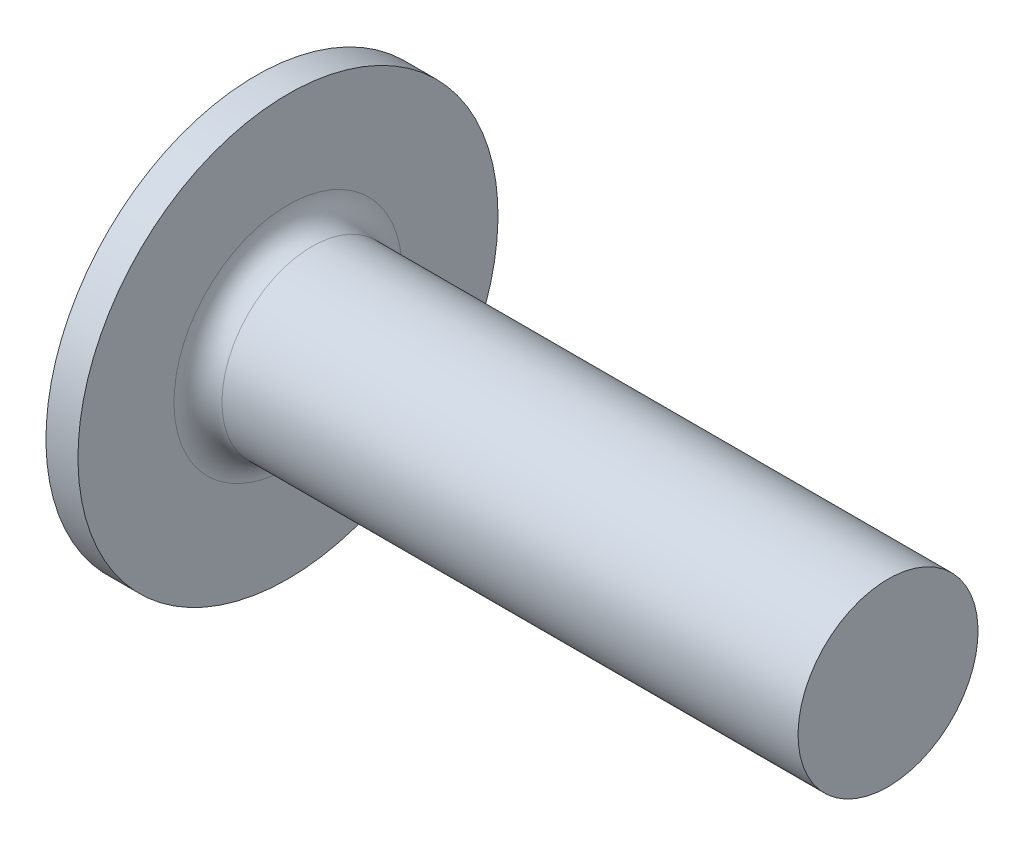
ISO-10303-21;
HEADER;
FILE_DESCRIPTION(('STEP AP214'),'2;1');
FILE_NAME('part.step','',(''),(''),'','','');
FILE_SCHEMA(('AUTOMOTIVE_DESIGN { 1 0 10303 214 1 1 1 1 }'));
ENDSEC;
DATA;
#1=APPLICATION_CONTEXT('core data for automotive mechanical design processes');
#2=APPLICATION_PROTOCOL_DEFINITION('international standard','automotive_design',2000,#1);
#3=PRODUCT_CONTEXT('',#1,'mechanical');
#4=PRODUCT('Part','Part','',(#3));
#5=PRODUCT_RELATED_PRODUCT_CATEGORY('part','',(#4));
#6=PRODUCT_DEFINITION_FORMATION('','',#4);
#7=PRODUCT_DEFINITION_CONTEXT('part definition',#1,'design');
#8=PRODUCT_DEFINITION('design','',#6,#7);
#9=PRODUCT_DEFINITION_SHAPE('','',#8);
#10=(LENGTH_UNIT() NAMED_UNIT(*) SI_UNIT(.MILLI.,.METRE.));
#11=(NAMED_UNIT(*) PLANE_ANGLE_UNIT() SI_UNIT($,.RADIAN.));
#12=(NAMED_UNIT(*) SI_UNIT($,.STERADIAN.) SOLID_ANGLE_UNIT());
#13=UNCERTAINTY_MEASURE_WITH_UNIT(LENGTH_MEASURE(1.E-05),#10,'distance_accuracy_value','');
#14=(GEOMETRIC_REPRESENTATION_CONTEXT(3) GLOBAL_UNCERTAINTY_ASSIGNED_CONTEXT((#13)) GLOBAL_UNIT_ASSIGNED_CONTEXT((#10,
#11,#12)) REPRESENTATION_CONTEXT('',''));
#15=CARTESIAN_POINT('',(0.,0.,0.));
#16=DIRECTION('',(0.,0.,1.));
#17=DIRECTION('',(1.,0.,0.));
#18=AXIS2_PLACEMENT_3D('',#15,#16,#17);
#19=CARTESIAN_POINT('',(-0.8,0.,0.));
#20=DIRECTION('',(1.,0.,0.));
#21=DIRECTION('',(0.,1.,0.));
#22=AXIS2_PLACEMENT_3D('',#19,#20,#21);
#23=PLANE('',#22);
#24=CARTESIAN_POINT('',(-0.8,0.,0.));
#25=DIRECTION('',(-1.,0.,0.));
#26=DIRECTION('',(0.,-1.,0.));
#27=AXIS2_PLACEMENT_3D('',#24,#25,#26);
#28=CIRCLE('',#27,3.0381197846483);
#29=CARTESIAN_POINT('',(-0.799999999999999,-3.0381197846483,0.));
#30=VERTEX_POINT('',#29);
#31=EDGE_CURVE('E214',#30,#30,#28,.T.);
#32=ORIENTED_EDGE('',*,*,#31,.T.);
#33=EDGE_LOOP('',(#32));
#34=FACE_BOUND('',#33,.T.);
#35=CARTESIAN_POINT('',(-0.8,0.82446015814705,0.476002294242327));
#36=DIRECTION('',(-1.,0.,0.));
#37=DIRECTION('',(0.,0.,-1.));
#38=AXIS2_PLACEMENT_3D('',#35,#36,#37);
#39=CIRCLE('',#38,0.317004588484645);
#40=CARTESIAN_POINT('',(-0.8,0.744268952333995,0.169308180130939));
#41=VERTEX_POINT('',#40);
#42=CARTESIAN_POINT('',(-0.8,0.518759661228898,0.559901729903804));
#43=VERTEX_POINT('',#42);
#44=EDGE_CURVE('E53',#41,#43,#39,.T.);
#45=ORIENTED_EDGE('',*,*,#44,.T.);
#46=CARTESIAN_POINT('',(-0.8,0.349999999999996,0.606217782649109));
#47=DIRECTION('',(1.,0.,0.));
#48=DIRECTION('',(0.,0.,-1.));
#49=AXIS2_PLACEMENT_3D('',#46,#47,#48);
#50=CIRCLE('',#49,0.174999999999998);
#51=CARTESIAN_POINT('',(-0.8,0.225509291105093,0.729209910034739));
#52=VERTEX_POINT('',#51);
#53=EDGE_CURVE('E161',#43,#52,#50,.T.);
#54=ORIENTED_EDGE('',*,*,#53,.T.);
#55=CARTESIAN_POINT('',(-0.8,0.,0.952004588484645));
#56=DIRECTION('',(-1.,0.,0.));
#57=DIRECTION('',(0.,0.,-1.));
#58=AXIS2_PLACEMENT_3D('',#55,#56,#57);
#59=CIRCLE('',#58,0.317004588484644);
#60=CARTESIAN_POINT('',(-0.8,-0.225509291105094,0.72920991003474));
#61=VERTEX_POINT('',#60);
#62=EDGE_CURVE('E164',#52,#61,#59,.T.);
#63=ORIENTED_EDGE('',*,*,#62,.T.);
#64=CARTESIAN_POINT('',(-0.8,-0.350000000000001,0.606217782649107));
#65=DIRECTION('',(1.,0.,0.));
#66=DIRECTION('',(0.,0.,-1.));
#67=AXIS2_PLACEMENT_3D('',#64,#65,#66);
#68=CIRCLE('',#67,0.175000000000001);
#69=CARTESIAN_POINT('',(-0.8,-0.518759661228905,0.559901729903797));
#70=VERTEX_POINT('',#69);
#71=EDGE_CURVE('E167',#61,#70,#68,.T.);
#72=ORIENTED_EDGE('',*,*,#71,.T.);
#73=CARTESIAN_POINT('',(-0.8,-0.824460158147046,0.476002294242316));
#74=DIRECTION('',(-1.,0.,0.));
#75=DIRECTION('',(0.,0.,-1.));
#76=AXIS2_PLACEMENT_3D('',#73,#74,#75);
#77=CIRCLE('',#76,0.317004588484636);
#78=CARTESIAN_POINT('',(-0.8,-0.744268952333995,0.16930818013094));
#79=VERTEX_POINT('',#78);
#80=EDGE_CURVE('E170',#70,#79,#77,.T.);
#81=ORIENTED_EDGE('',*,*,#80,.T.);
#82=CARTESIAN_POINT('',(-0.8,-0.7,0.));
#83=DIRECTION('',(1.,0.,0.));
#84=DIRECTION('',(0.,0.,-1.));
#85=AXIS2_PLACEMENT_3D('',#82,#83,#84);
#86=CIRCLE('',#85,0.175000000000001);
#87=CARTESIAN_POINT('',(-0.8,-0.744268952333996,-0.169308180130941));
#88=VERTEX_POINT('',#87);
#89=EDGE_CURVE('E173',#79,#88,#86,.T.);
#90=ORIENTED_EDGE('',*,*,#89,.T.);
#91=CARTESIAN_POINT('',(-0.8,-0.82446015814705,-0.476002294242326));
#92=DIRECTION('',(-1.,0.,0.));
#93=DIRECTION('',(0.,0.,-1.));
#94=AXIS2_PLACEMENT_3D('',#91,#92,#93);
#95=CIRCLE('',#94,0.317004588484645);
#96=CARTESIAN_POINT('',(-0.8,-0.518759661228898,-0.559901729903804));
#97=VERTEX_POINT('',#96);
#98=EDGE_CURVE('E176',#88,#97,#95,.T.);
#99=ORIENTED_EDGE('',*,*,#98,.T.);
#100=CARTESIAN_POINT('',(-0.8,-0.349999999999996,-0.606217782649109));
#101=DIRECTION('',(1.,0.,0.));
#102=DIRECTION('',(0.,0.,-1.));
#103=AXIS2_PLACEMENT_3D('',#100,#101,#102);
#104=CIRCLE('',#103,0.174999999999999);
#105=CARTESIAN_POINT('',(-0.8,-0.225509291105093,-0.729209910034739));
#106=VERTEX_POINT('',#105);
#107=EDGE_CURVE('E179',#97,#106,#104,.T.);
#108=ORIENTED_EDGE('',*,*,#107,.T.);
#109=CARTESIAN_POINT('',(-0.8,0.,-0.952004588484645));
#110=DIRECTION('',(-1.,0.,0.));
#111=DIRECTION('',(0.,0.,-1.));
#112=AXIS2_PLACEMENT_3D('',#109,#110,#111);
#113=CIRCLE('',#112,0.317004588484644);
#114=CARTESIAN_POINT('',(-0.8,0.225509291105094,-0.729209910034739));
#115=VERTEX_POINT('',#114);
#116=EDGE_CURVE('E182',#106,#115,#113,.T.);
#117=ORIENTED_EDGE('',*,*,#116,.T.);
#118=CARTESIAN_POINT('',(-0.8,0.350000000000001,-0.606217782649107));
#119=DIRECTION('',(1.,0.,0.));
#120=DIRECTION('',(0.,0.,-1.));
#121=AXIS2_PLACEMENT_3D('',#118,#119,#120);
#122=CIRCLE('',#121,0.175);
#123=CARTESIAN_POINT('',(-0.8,0.518759661228904,-0.5599017299038));
#124=VERTEX_POINT('',#123);
#125=EDGE_CURVE('E185',#115,#124,#122,.T.);
#126=ORIENTED_EDGE('',*,*,#125,.T.);
#127=CARTESIAN_POINT('',(-0.8,0.824460158147054,-0.47600229424232));
#128=DIRECTION('',(-1.,0.,0.));
#129=DIRECTION('',(0.,0.,-1.));
#130=AXIS2_PLACEMENT_3D('',#127,#128,#129);
#131=CIRCLE('',#130,0.317004588484644);
#132=CARTESIAN_POINT('',(-0.8,0.744268952333997,-0.169308180130939));
#133=VERTEX_POINT('',#132);
#134=EDGE_CURVE('E151',#124,#133,#131,.T.);
#135=ORIENTED_EDGE('',*,*,#134,.T.);
#136=CARTESIAN_POINT('',(-0.8,0.7,0.));
#137=DIRECTION('',(1.,0.,0.));
#138=DIRECTION('',(0.,0.,-1.));
#139=AXIS2_PLACEMENT_3D('',#136,#137,#138);
#140=CIRCLE('',#139,0.175);
#141=EDGE_CURVE('E188',#133,#41,#140,.T.);
#142=ORIENTED_EDGE('',*,*,#141,.T.);
#143=EDGE_LOOP('',(#45,#54,#63,#72,#81,#90,#99,#108,#117,#126,#135,#142));
#144=FACE_BOUND('',#143,.T.);
#145=ADVANCED_FACE('F38',(#34,#144),#23,.F.);
#146=CARTESIAN_POINT('',(0.,3.5,0.));
#147=DIRECTION('',(-1.,0.,0.));
#148=DIRECTION('',(0.,-1.,0.));
#149=AXIS2_PLACEMENT_3D('',#146,#147,#148);
#150=PLANE('',#149);
#151=CARTESIAN_POINT('',(0.,0.,0.));
#152=DIRECTION('',(-1.,0.,0.));
#153=DIRECTION('',(0.,-1.,0.));
#154=AXIS2_PLACEMENT_3D('',#151,#152,#153);
#155=CIRCLE('',#154,1.9);
#156=CARTESIAN_POINT('',(0.,-1.9,0.));
#157=VERTEX_POINT('',#156);
#158=EDGE_CURVE('E46',#157,#157,#155,.T.);
#159=ORIENTED_EDGE('',*,*,#158,.T.);
#160=EDGE_LOOP('',(#159));
#161=FACE_BOUND('',#160,.T.);
#162=CARTESIAN_POINT('',(0.,0.,0.));
#163=DIRECTION('',(-1.,0.,0.));
#164=DIRECTION('',(0.,-1.,0.));
#165=AXIS2_PLACEMENT_3D('',#162,#163,#164);
#166=CIRCLE('',#165,3.5);
#167=CARTESIAN_POINT('',(0.,-3.5,0.));
#168=VERTEX_POINT('',#167);
#169=EDGE_CURVE('E220',#168,#168,#166,.T.);
#170=ORIENTED_EDGE('',*,*,#169,.F.);
#171=EDGE_LOOP('',(#170));
#172=FACE_BOUND('',#171,.T.);
#173=ADVANCED_FACE('F225',(#161,#172),#150,.F.);
#174=CARTESIAN_POINT('',(-0.8,0.,0.));
#175=DIRECTION('',(-1.,0.,0.));
#176=DIRECTION('',(0.,-1.,0.));
#177=AXIS2_PLACEMENT_3D('',#174,#175,#176);
#178=CYLINDRICAL_SURFACE('',#177,3.5);
#179=CARTESIAN_POINT('',(-0.533333333333333,0.,0.));
#180=DIRECTION('',(-1.,0.,0.));
#181=DIRECTION('',(0.,-1.,0.));
#182=AXIS2_PLACEMENT_3D('',#179,#180,#181);
#183=CIRCLE('',#182,3.5);
#184=CARTESIAN_POINT('',(-0.533333333333333,-3.5,0.));
#185=VERTEX_POINT('',#184);
#186=EDGE_CURVE('E217',#185,#185,#183,.T.);
#187=ORIENTED_EDGE('',*,*,#186,.F.);
#188=EDGE_LOOP('',(#187));
#189=FACE_BOUND('',#188,.T.);
#190=ORIENTED_EDGE('',*,*,#169,.T.);
#191=EDGE_LOOP('',(#190));
#192=FACE_BOUND('',#191,.T.);
#193=ADVANCED_FACE('F242',(#189,#192),#178,.T.);
#194=CARTESIAN_POINT('',(-0.533333333333333,0.,0.));
#195=DIRECTION('',(1.,0.,0.));
#196=DIRECTION('',(0.,1.,0.));
#197=AXIS2_PLACEMENT_3D('',#194,#195,#196);
#198=CONICAL_SURFACE('',#197,3.5,1.0471975511966);
#199=ORIENTED_EDGE('',*,*,#31,.F.);
#200=EDGE_LOOP('',(#199));
#201=FACE_BOUND('',#200,.T.);
#202=ORIENTED_EDGE('',*,*,#186,.T.);
#203=EDGE_LOOP('',(#202));
#204=FACE_BOUND('',#203,.T.);
#205=ADVANCED_FACE('F248',(#201,#204),#198,.T.);
#206=CARTESIAN_POINT('',(10.,1.5,0.));
#207=DIRECTION('',(-1.,0.,0.));
#208=DIRECTION('',(0.,-1.,0.));
#209=AXIS2_PLACEMENT_3D('',#206,#207,#208);
#210=PLANE('',#209);
#211=CARTESIAN_POINT('',(10.,0.,0.));
#212=DIRECTION('',(-1.,0.,0.));
#213=DIRECTION('',(0.,-1.,0.));
#214=AXIS2_PLACEMENT_3D('',#211,#212,#213);
#215=CIRCLE('',#214,1.5);
#216=CARTESIAN_POINT('',(10.,-1.5,0.));
#217=VERTEX_POINT('',#216);
#218=EDGE_CURVE('E211',#217,#217,#215,.T.);
#219=ORIENTED_EDGE('',*,*,#218,.F.);
#220=EDGE_LOOP('',(#219));
#221=FACE_BOUND('',#220,.T.);
#222=ADVANCED_FACE('F246',(#221),#210,.F.);
#223=CARTESIAN_POINT('',(-0.8,0.,0.));
#224=DIRECTION('',(-1.,0.,0.));
#225=DIRECTION('',(0.,-1.,0.));
#226=AXIS2_PLACEMENT_3D('',#223,#224,#225);
#227=CYLINDRICAL_SURFACE('',#226,1.5);
#228=CARTESIAN_POINT('',(0.4,0.,0.));
#229=DIRECTION('',(-1.,0.,0.));
#230=DIRECTION('',(0.,-1.,0.));
#231=AXIS2_PLACEMENT_3D('',#228,#229,#230);
#232=CIRCLE('',#231,1.5);
#233=CARTESIAN_POINT('',(0.4,-1.5,0.));
#234=VERTEX_POINT('',#233);
#235=EDGE_CURVE('E11',#234,#234,#232,.F.);
#236=ORIENTED_EDGE('',*,*,#235,.T.);
#237=EDGE_LOOP('',(#236));
#238=FACE_BOUND('',#237,.T.);
#239=ORIENTED_EDGE('',*,*,#218,.T.);
#240=EDGE_LOOP('',(#239));
#241=FACE_BOUND('',#240,.T.);
#242=ADVANCED_FACE('F272',(#238,#241),#227,.T.);
#243=CARTESIAN_POINT('',(-0.05,0.82446015814705,0.476002294242327));
#244=DIRECTION('',(-1.,0.,0.));
#245=DIRECTION('',(0.,0.,1.));
#246=AXIS2_PLACEMENT_3D('',#243,#244,#245);
#247=CYLINDRICAL_SURFACE('',#246,0.317004588484645);
#248=ORIENTED_EDGE('',*,*,#44,.F.);
#249=DIRECTION('',(-1.,0.,0.));
#250=VECTOR('',#249,1.);
#251=CARTESIAN_POINT('',(-0.05,0.744268952333995,0.169308180130939));
#252=LINE('',#251,#250);
#253=CARTESIAN_POINT('',(-0.05,0.744268952333995,0.169308180130939));
#254=VERTEX_POINT('',#253);
#255=EDGE_CURVE('E156',#254,#41,#252,.T.);
#256=ORIENTED_EDGE('',*,*,#255,.F.);
#257=CARTESIAN_POINT('',(-0.05,0.82446015814705,0.476002294242327));
#258=DIRECTION('',(-1.,0.,0.));
#259=DIRECTION('',(0.,0.,-1.));
#260=AXIS2_PLACEMENT_3D('',#257,#258,#259);
#261=CIRCLE('',#260,0.317004588484645);
#262=CARTESIAN_POINT('',(-0.05,0.518759661228898,0.559901729903804));
#263=VERTEX_POINT('',#262);
#264=EDGE_CURVE('E191',#254,#263,#261,.T.);
#265=ORIENTED_EDGE('',*,*,#264,.T.);
#266=DIRECTION('',(-1.,0.,0.));
#267=VECTOR('',#266,1.);
#268=CARTESIAN_POINT('',(-0.05,0.518759661228898,0.559901729903804));
#269=LINE('',#268,#267);
#270=EDGE_CURVE('E209',#263,#43,#269,.T.);
#271=ORIENTED_EDGE('',*,*,#270,.T.);
#272=EDGE_LOOP('',(#248,#256,#265,#271));
#273=FACE_BOUND('',#272,.T.);
#274=ADVANCED_FACE('F279',(#273),#247,.T.);
#275=CARTESIAN_POINT('',(-0.05,0.349999999999996,0.606217782649109));
#276=DIRECTION('',(-1.,0.,0.));
#277=DIRECTION('',(0.,0.,1.));
#278=AXIS2_PLACEMENT_3D('',#275,#276,#277);
#279=CYLINDRICAL_SURFACE('',#278,0.174999999999998);
#280=ORIENTED_EDGE('',*,*,#53,.F.);
#281=ORIENTED_EDGE('',*,*,#270,.F.);
#282=CARTESIAN_POINT('',(-0.05,0.349999999999996,0.606217782649109));
#283=DIRECTION('',(1.,0.,0.));
#284=DIRECTION('',(0.,0.,-1.));
#285=AXIS2_PLACEMENT_3D('',#282,#283,#284);
#286=CIRCLE('',#285,0.174999999999998);
#287=CARTESIAN_POINT('',(-0.05,0.225509291105093,0.729209910034739));
#288=VERTEX_POINT('',#287);
#289=EDGE_CURVE('E110',#263,#288,#286,.T.);
#290=ORIENTED_EDGE('',*,*,#289,.T.);
#291=DIRECTION('',(-1.,0.,0.));
#292=VECTOR('',#291,1.);
#293=CARTESIAN_POINT('',(-0.05,0.225509291105093,0.729209910034739));
#294=LINE('',#293,#292);
#295=EDGE_CURVE('E207',#288,#52,#294,.T.);
#296=ORIENTED_EDGE('',*,*,#295,.T.);
#297=EDGE_LOOP('',(#280,#281,#290,#296));
#298=FACE_BOUND('',#297,.T.);
#299=ADVANCED_FACE('F287',(#298),#279,.F.);
#300=CARTESIAN_POINT('',(-0.05,0.,0.952004588484645));
#301=DIRECTION('',(-1.,0.,0.));
#302=DIRECTION('',(0.,0.,1.));
#303=AXIS2_PLACEMENT_3D('',#300,#301,#302);
#304=CYLINDRICAL_SURFACE('',#303,0.317004588484644);
#305=ORIENTED_EDGE('',*,*,#62,.F.);
#306=ORIENTED_EDGE('',*,*,#295,.F.);
#307=CARTESIAN_POINT('',(-0.05,0.,0.952004588484645));
#308=DIRECTION('',(-1.,0.,0.));
#309=DIRECTION('',(0.,0.,-1.));
#310=AXIS2_PLACEMENT_3D('',#307,#308,#309);
#311=CIRCLE('',#310,0.317004588484644);
#312=CARTESIAN_POINT('',(-0.05,-0.225509291105094,0.72920991003474));
#313=VERTEX_POINT('',#312);
#314=EDGE_CURVE('E438',#288,#313,#311,.T.);
#315=ORIENTED_EDGE('',*,*,#314,.T.);
#316=DIRECTION('',(-1.,0.,0.));
#317=VECTOR('',#316,1.);
#318=CARTESIAN_POINT('',(-0.05,-0.225509291105094,0.72920991003474));
#319=LINE('',#318,#317);
#320=EDGE_CURVE('E205',#313,#61,#319,.T.);
#321=ORIENTED_EDGE('',*,*,#320,.T.);
#322=EDGE_LOOP('',(#305,#306,#315,#321));
#323=FACE_BOUND('',#322,.T.);
#324=ADVANCED_FACE('F294',(#323),#304,.T.);
#325=CARTESIAN_POINT('',(-0.05,-0.350000000000001,0.606217782649107));
#326=DIRECTION('',(-1.,0.,0.));
#327=DIRECTION('',(0.,0.,1.));
#328=AXIS2_PLACEMENT_3D('',#325,#326,#327);
#329=CYLINDRICAL_SURFACE('',#328,0.175000000000001);
#330=ORIENTED_EDGE('',*,*,#71,.F.);
#331=ORIENTED_EDGE('',*,*,#320,.F.);
#332=CARTESIAN_POINT('',(-0.05,-0.350000000000001,0.606217782649107));
#333=DIRECTION('',(1.,0.,0.));
#334=DIRECTION('',(0.,0.,-1.));
#335=AXIS2_PLACEMENT_3D('',#332,#333,#334);
#336=CIRCLE('',#335,0.175000000000001);
#337=CARTESIAN_POINT('',(-0.05,-0.518759661228905,0.559901729903797));
#338=VERTEX_POINT('',#337);
#339=EDGE_CURVE('E436',#313,#338,#336,.T.);
#340=ORIENTED_EDGE('',*,*,#339,.T.);
#341=DIRECTION('',(-1.,0.,0.));
#342=VECTOR('',#341,1.);
#343=CARTESIAN_POINT('',(-0.05,-0.518759661228905,0.559901729903797));
#344=LINE('',#343,#342);
#345=EDGE_CURVE('E203',#338,#70,#344,.T.);
#346=ORIENTED_EDGE('',*,*,#345,.T.);
#347=EDGE_LOOP('',(#330,#331,#340,#346));
#348=FACE_BOUND('',#347,.T.);
#349=ADVANCED_FACE('F302',(#348),#329,.F.);
#350=CARTESIAN_POINT('',(-0.05,-0.824460158147046,0.476002294242316));
#351=DIRECTION('',(-1.,0.,0.));
#352=DIRECTION('',(0.,0.,1.));
#353=AXIS2_PLACEMENT_3D('',#350,#351,#352);
#354=CYLINDRICAL_SURFACE('',#353,0.317004588484636);
#355=ORIENTED_EDGE('',*,*,#80,.F.);
#356=ORIENTED_EDGE('',*,*,#345,.F.);
#357=CARTESIAN_POINT('',(-0.05,-0.824460158147046,0.476002294242316));
#358=DIRECTION('',(-1.,0.,0.));
#359=DIRECTION('',(0.,0.,-1.));
#360=AXIS2_PLACEMENT_3D('',#357,#358,#359);
#361=CIRCLE('',#360,0.317004588484636);
#362=CARTESIAN_POINT('',(-0.05,-0.744268952333995,0.16930818013094));
#363=VERTEX_POINT('',#362);
#364=EDGE_CURVE('E434',#338,#363,#361,.T.);
#365=ORIENTED_EDGE('',*,*,#364,.T.);
#366=DIRECTION('',(-1.,0.,0.));
#367=VECTOR('',#366,1.);
#368=CARTESIAN_POINT('',(-0.05,-0.744268952333995,0.16930818013094));
#369=LINE('',#368,#367);
#370=EDGE_CURVE('E201',#363,#79,#369,.T.);
#371=ORIENTED_EDGE('',*,*,#370,.T.);
#372=EDGE_LOOP('',(#355,#356,#365,#371));
#373=FACE_BOUND('',#372,.T.);
#374=ADVANCED_FACE('F310',(#373),#354,.T.);
#375=CARTESIAN_POINT('',(-0.05,-0.7,0.));
#376=DIRECTION('',(-1.,0.,0.));
#377=DIRECTION('',(0.,0.,1.));
#378=AXIS2_PLACEMENT_3D('',#375,#376,#377);
#379=CYLINDRICAL_SURFACE('',#378,0.175000000000001);
#380=ORIENTED_EDGE('',*,*,#89,.F.);
#381=ORIENTED_EDGE('',*,*,#370,.F.);
#382=CARTESIAN_POINT('',(-0.05,-0.7,0.));
#383=DIRECTION('',(1.,0.,0.));
#384=DIRECTION('',(0.,0.,-1.));
#385=AXIS2_PLACEMENT_3D('',#382,#383,#384);
#386=CIRCLE('',#385,0.175000000000001);
#387=CARTESIAN_POINT('',(-0.05,-0.744268952333996,-0.169308180130941));
#388=VERTEX_POINT('',#387);
#389=EDGE_CURVE('E432',#363,#388,#386,.T.);
#390=ORIENTED_EDGE('',*,*,#389,.T.);
#391=DIRECTION('',(-1.,0.,0.));
#392=VECTOR('',#391,1.);
#393=CARTESIAN_POINT('',(-0.05,-0.744268952333996,-0.169308180130941));
#394=LINE('',#393,#392);
#395=EDGE_CURVE('E199',#388,#88,#394,.T.);
#396=ORIENTED_EDGE('',*,*,#395,.T.);
#397=EDGE_LOOP('',(#380,#381,#390,#396));
#398=FACE_BOUND('',#397,.T.);
#399=ADVANCED_FACE('F318',(#398),#379,.F.);
#400=CARTESIAN_POINT('',(-0.05,-0.82446015814705,-0.476002294242326));
#401=DIRECTION('',(-1.,0.,0.));
#402=DIRECTION('',(0.,0.,1.));
#403=AXIS2_PLACEMENT_3D('',#400,#401,#402);
#404=CYLINDRICAL_SURFACE('',#403,0.317004588484645);
#405=ORIENTED_EDGE('',*,*,#98,.F.);
#406=ORIENTED_EDGE('',*,*,#395,.F.);
#407=CARTESIAN_POINT('',(-0.05,-0.82446015814705,-0.476002294242326));
#408=DIRECTION('',(-1.,0.,0.));
#409=DIRECTION('',(0.,0.,-1.));
#410=AXIS2_PLACEMENT_3D('',#407,#408,#409);
#411=CIRCLE('',#410,0.317004588484645);
#412=CARTESIAN_POINT('',(-0.05,-0.518759661228898,-0.559901729903804));
#413=VERTEX_POINT('',#412);
#414=EDGE_CURVE('E428',#388,#413,#411,.T.);
#415=ORIENTED_EDGE('',*,*,#414,.T.);
#416=DIRECTION('',(-1.,0.,0.));
#417=VECTOR('',#416,1.);
#418=CARTESIAN_POINT('',(-0.05,-0.518759661228898,-0.559901729903804));
#419=LINE('',#418,#417);
#420=EDGE_CURVE('E197',#413,#97,#419,.T.);
#421=ORIENTED_EDGE('',*,*,#420,.T.);
#422=EDGE_LOOP('',(#405,#406,#415,#421));
#423=FACE_BOUND('',#422,.T.);
#424=ADVANCED_FACE('F326',(#423),#404,.T.);
#425=CARTESIAN_POINT('',(-0.05,-0.349999999999996,-0.606217782649109));
#426=DIRECTION('',(-1.,0.,0.));
#427=DIRECTION('',(0.,0.,1.));
#428=AXIS2_PLACEMENT_3D('',#425,#426,#427);
#429=CYLINDRICAL_SURFACE('',#428,0.174999999999999);
#430=ORIENTED_EDGE('',*,*,#107,.F.);
#431=ORIENTED_EDGE('',*,*,#420,.F.);
#432=CARTESIAN_POINT('',(-0.05,-0.349999999999996,-0.606217782649109));
#433=DIRECTION('',(1.,0.,0.));
#434=DIRECTION('',(0.,0.,-1.));
#435=AXIS2_PLACEMENT_3D('',#432,#433,#434);
#436=CIRCLE('',#435,0.174999999999999);
#437=CARTESIAN_POINT('',(-0.05,-0.225509291105093,-0.729209910034739));
#438=VERTEX_POINT('',#437);
#439=EDGE_CURVE('E427',#413,#438,#436,.T.);
#440=ORIENTED_EDGE('',*,*,#439,.T.);
#441=DIRECTION('',(-1.,0.,0.));
#442=VECTOR('',#441,1.);
#443=CARTESIAN_POINT('',(-0.05,-0.225509291105093,-0.729209910034739));
#444=LINE('',#443,#442);
#445=EDGE_CURVE('E195',#438,#106,#444,.T.);
#446=ORIENTED_EDGE('',*,*,#445,.T.);
#447=EDGE_LOOP('',(#430,#431,#440,#446));
#448=FACE_BOUND('',#447,.T.);
#449=ADVANCED_FACE('F334',(#448),#429,.F.);
#450=CARTESIAN_POINT('',(-0.05,0.,-0.952004588484645));
#451=DIRECTION('',(-1.,0.,0.));
#452=DIRECTION('',(0.,0.,1.));
#453=AXIS2_PLACEMENT_3D('',#450,#451,#452);
#454=CYLINDRICAL_SURFACE('',#453,0.317004588484644);
#455=ORIENTED_EDGE('',*,*,#116,.F.);
#456=ORIENTED_EDGE('',*,*,#445,.F.);
#457=CARTESIAN_POINT('',(-0.05,0.,-0.952004588484645));
#458=DIRECTION('',(-1.,0.,0.));
#459=DIRECTION('',(0.,0.,-1.));
#460=AXIS2_PLACEMENT_3D('',#457,#458,#459);
#461=CIRCLE('',#460,0.317004588484644);
#462=CARTESIAN_POINT('',(-0.05,0.225509291105094,-0.729209910034739));
#463=VERTEX_POINT('',#462);
#464=EDGE_CURVE('E147',#438,#463,#461,.T.);
#465=ORIENTED_EDGE('',*,*,#464,.T.);
#466=DIRECTION('',(-1.,0.,0.));
#467=VECTOR('',#466,1.);
#468=CARTESIAN_POINT('',(-0.05,0.225509291105094,-0.729209910034739));
#469=LINE('',#468,#467);
#470=EDGE_CURVE('E143',#463,#115,#469,.T.);
#471=ORIENTED_EDGE('',*,*,#470,.T.);
#472=EDGE_LOOP('',(#455,#456,#465,#471));
#473=FACE_BOUND('',#472,.T.);
#474=ADVANCED_FACE('F342',(#473),#454,.T.);
#475=CARTESIAN_POINT('',(-0.05,0.350000000000001,-0.606217782649107));
#476=DIRECTION('',(-1.,0.,0.));
#477=DIRECTION('',(0.,0.,1.));
#478=AXIS2_PLACEMENT_3D('',#475,#476,#477);
#479=CYLINDRICAL_SURFACE('',#478,0.175);
#480=ORIENTED_EDGE('',*,*,#125,.F.);
#481=ORIENTED_EDGE('',*,*,#470,.F.);
#482=CARTESIAN_POINT('',(-0.05,0.350000000000001,-0.606217782649107));
#483=DIRECTION('',(1.,0.,0.));
#484=DIRECTION('',(0.,0.,-1.));
#485=AXIS2_PLACEMENT_3D('',#482,#483,#484);
#486=CIRCLE('',#485,0.175);
#487=CARTESIAN_POINT('',(-0.05,0.518759661228904,-0.5599017299038));
#488=VERTEX_POINT('',#487);
#489=EDGE_CURVE('E138',#463,#488,#486,.T.);
#490=ORIENTED_EDGE('',*,*,#489,.T.);
#491=DIRECTION('',(-1.,0.,0.));
#492=VECTOR('',#491,1.);
#493=CARTESIAN_POINT('',(-0.05,0.518759661228904,-0.5599017299038));
#494=LINE('',#493,#492);
#495=EDGE_CURVE('E142',#488,#124,#494,.T.);
#496=ORIENTED_EDGE('',*,*,#495,.T.);
#497=EDGE_LOOP('',(#480,#481,#490,#496));
#498=FACE_BOUND('',#497,.T.);
#499=ADVANCED_FACE('F141',(#498),#479,.F.);
#500=CARTESIAN_POINT('',(-0.05,0.824460158147054,-0.47600229424232));
#501=DIRECTION('',(-1.,0.,0.));
#502=DIRECTION('',(0.,0.,1.));
#503=AXIS2_PLACEMENT_3D('',#500,#501,#502);
#504=CYLINDRICAL_SURFACE('',#503,0.317004588484644);
#505=ORIENTED_EDGE('',*,*,#134,.F.);
#506=ORIENTED_EDGE('',*,*,#495,.F.);
#507=CARTESIAN_POINT('',(-0.05,0.824460158147054,-0.47600229424232));
#508=DIRECTION('',(-1.,0.,0.));
#509=DIRECTION('',(0.,0.,-1.));
#510=AXIS2_PLACEMENT_3D('',#507,#508,#509);
#511=CIRCLE('',#510,0.317004588484644);
#512=CARTESIAN_POINT('',(-0.05,0.744268952333997,-0.169308180130939));
#513=VERTEX_POINT('',#512);
#514=EDGE_CURVE('E146',#488,#513,#511,.T.);
#515=ORIENTED_EDGE('',*,*,#514,.T.);
#516=DIRECTION('',(-1.,0.,0.));
#517=VECTOR('',#516,1.);
#518=CARTESIAN_POINT('',(-0.05,0.744268952333997,-0.169308180130939));
#519=LINE('',#518,#517);
#520=EDGE_CURVE('E101',#513,#133,#519,.T.);
#521=ORIENTED_EDGE('',*,*,#520,.T.);
#522=EDGE_LOOP('',(#505,#506,#515,#521));
#523=FACE_BOUND('',#522,.T.);
#524=ADVANCED_FACE('F149',(#523),#504,.T.);
#525=CARTESIAN_POINT('',(-0.05,0.7,0.));
#526=DIRECTION('',(-1.,0.,0.));
#527=DIRECTION('',(0.,0.,1.));
#528=AXIS2_PLACEMENT_3D('',#525,#526,#527);
#529=CYLINDRICAL_SURFACE('',#528,0.175);
#530=ORIENTED_EDGE('',*,*,#141,.F.);
#531=ORIENTED_EDGE('',*,*,#520,.F.);
#532=CARTESIAN_POINT('',(-0.05,0.7,0.));
#533=DIRECTION('',(1.,0.,0.));
#534=DIRECTION('',(0.,0.,-1.));
#535=AXIS2_PLACEMENT_3D('',#532,#533,#534);
#536=CIRCLE('',#535,0.175);
#537=EDGE_CURVE('E61',#513,#254,#536,.T.);
#538=ORIENTED_EDGE('',*,*,#537,.T.);
#539=ORIENTED_EDGE('',*,*,#255,.T.);
#540=EDGE_LOOP('',(#530,#531,#538,#539));
#541=FACE_BOUND('',#540,.T.);
#542=ADVANCED_FACE('F233',(#541),#529,.F.);
#543=CARTESIAN_POINT('',(-0.05,0.762230079073525,0.238001147121163));
#544=DIRECTION('',(1.,0.,0.));
#545=DIRECTION('',(0.,0.,-1.));
#546=AXIS2_PLACEMENT_3D('',#543,#544,#545);
#547=PLANE('',#546);
#548=ORIENTED_EDGE('',*,*,#264,.F.);
#549=ORIENTED_EDGE('',*,*,#537,.F.);
#550=ORIENTED_EDGE('',*,*,#514,.F.);
#551=ORIENTED_EDGE('',*,*,#489,.F.);
#552=ORIENTED_EDGE('',*,*,#464,.F.);
#553=ORIENTED_EDGE('',*,*,#439,.F.);
#554=ORIENTED_EDGE('',*,*,#414,.F.);
#555=ORIENTED_EDGE('',*,*,#389,.F.);
#556=ORIENTED_EDGE('',*,*,#364,.F.);
#557=ORIENTED_EDGE('',*,*,#339,.F.);
#558=ORIENTED_EDGE('',*,*,#314,.F.);
#559=ORIENTED_EDGE('',*,*,#289,.F.);
#560=EDGE_LOOP('',(#548,#549,#550,#551,#552,#553,#554,#555,#556,#557,#558,#559));
#561=FACE_BOUND('',#560,.T.);
#562=ADVANCED_FACE('F154',(#561),#547,.F.);
#563=CARTESIAN_POINT('',(0.4,0.,0.));
#564=DIRECTION('',(-1.,0.,0.));
#565=DIRECTION('',(0.,-1.,0.));
#566=AXIS2_PLACEMENT_3D('',#563,#564,#565);
#567=TOROIDAL_SURFACE('',#566,1.9,0.4);
#568=ORIENTED_EDGE('',*,*,#235,.F.);
#569=EDGE_LOOP('',(#568));
#570=FACE_BOUND('',#569,.T.);
#571=ORIENTED_EDGE('',*,*,#158,.F.);
#572=EDGE_LOOP('',(#571));
#573=FACE_BOUND('',#572,.T.);
#574=ADVANCED_FACE('F40',(#570,#573),#567,.F.);
#575=CLOSED_SHELL('',(#145,#173,#193,#205,#222,#242,#274,#299,#324,#349,#374,#399,#424,#449,
#474,#499,#524,#542,#562,#574));
#576=MANIFOLD_SOLID_BREP('B2',#575);
#577=ADVANCED_BREP_SHAPE_REPRESENTATION('',(#18,#576),#14);
#578=SHAPE_DEFINITION_REPRESENTATION(#9,#577);
ENDSEC;
END-ISO-10303-21;
